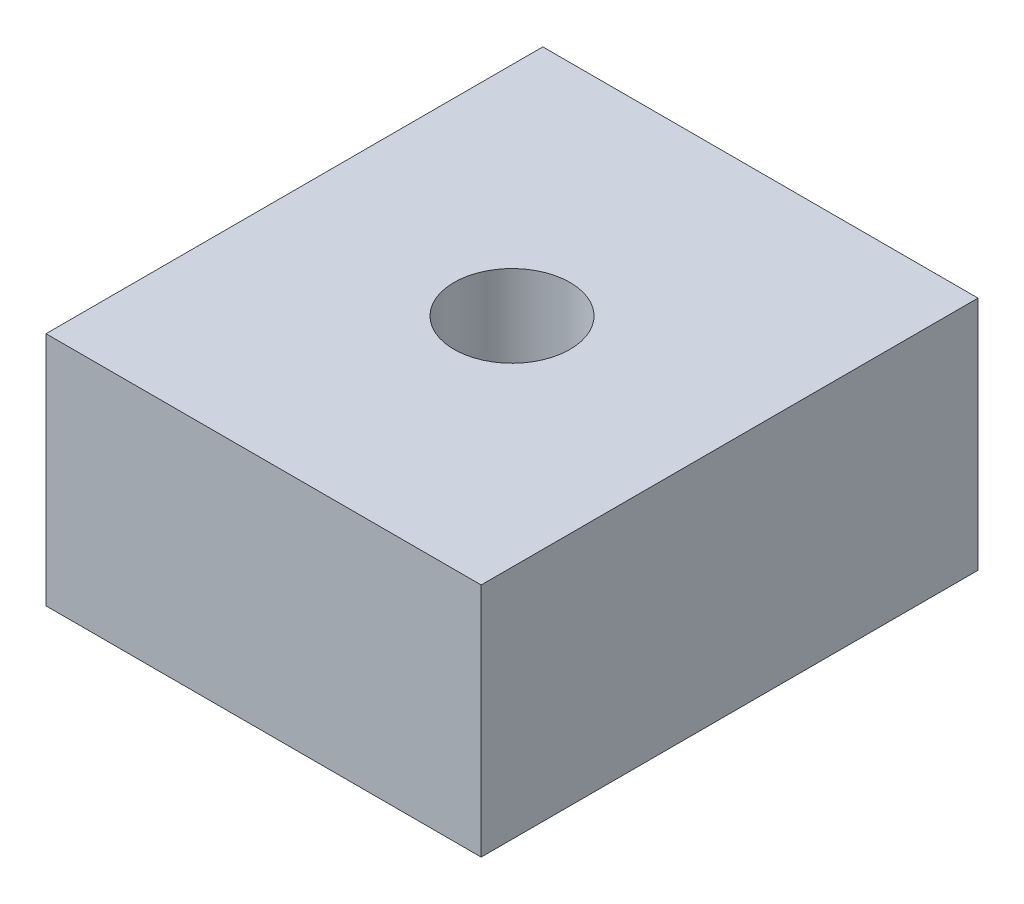
ISO-10303-21;
HEADER;
FILE_DESCRIPTION(('STEP AP214'),'2;1');
FILE_NAME('part.step','',(''),(''),'','','');
FILE_SCHEMA(('AUTOMOTIVE_DESIGN { 1 0 10303 214 1 1 1 1 }'));
ENDSEC;
DATA;
#1=APPLICATION_CONTEXT('core data for automotive mechanical design processes');
#2=APPLICATION_PROTOCOL_DEFINITION('international standard','automotive_design',2000,#1);
#3=PRODUCT_CONTEXT('',#1,'mechanical');
#4=PRODUCT('Part','Part','',(#3));
#5=PRODUCT_RELATED_PRODUCT_CATEGORY('part','',(#4));
#6=PRODUCT_DEFINITION_FORMATION('','',#4);
#7=PRODUCT_DEFINITION_CONTEXT('part definition',#1,'design');
#8=PRODUCT_DEFINITION('design','',#6,#7);
#9=PRODUCT_DEFINITION_SHAPE('','',#8);
#10=(LENGTH_UNIT() NAMED_UNIT(*) SI_UNIT(.MILLI.,.METRE.));
#11=(NAMED_UNIT(*) PLANE_ANGLE_UNIT() SI_UNIT($,.RADIAN.));
#12=(NAMED_UNIT(*) SI_UNIT($,.STERADIAN.) SOLID_ANGLE_UNIT());
#13=UNCERTAINTY_MEASURE_WITH_UNIT(LENGTH_MEASURE(1.E-05),#10,'distance_accuracy_value','');
#14=(GEOMETRIC_REPRESENTATION_CONTEXT(3) GLOBAL_UNCERTAINTY_ASSIGNED_CONTEXT((#13)) GLOBAL_UNIT_ASSIGNED_CONTEXT((#10,
#11,#12)) REPRESENTATION_CONTEXT('',''));
#15=CARTESIAN_POINT('',(0.,0.,0.));
#16=DIRECTION('',(0.,0.,1.));
#17=DIRECTION('',(1.,0.,0.));
#18=AXIS2_PLACEMENT_3D('',#15,#16,#17);
#19=CARTESIAN_POINT('',(-6.,6.5,6.85));
#20=DIRECTION('',(1.,0.,0.));
#21=DIRECTION('',(0.,0.,-1.));
#22=AXIS2_PLACEMENT_3D('',#19,#20,#21);
#23=PLANE('',#22);
#24=DIRECTION('',(0.,0.,1.));
#25=VECTOR('',#24,1.);
#26=CARTESIAN_POINT('',(-6.,0.,6.85));
#27=LINE('',#26,#25);
#28=CARTESIAN_POINT('',(-6.,0.,-6.85));
#29=VERTEX_POINT('',#28);
#30=CARTESIAN_POINT('',(-6.,0.,6.85));
#31=VERTEX_POINT('',#30);
#32=EDGE_CURVE('E168',#29,#31,#27,.T.);
#33=ORIENTED_EDGE('',*,*,#32,.T.);
#34=DIRECTION('',(0.,-1.,0.));
#35=VECTOR('',#34,1.);
#36=CARTESIAN_POINT('',(-6.,6.5,6.85));
#37=LINE('',#36,#35);
#38=CARTESIAN_POINT('',(-6.,6.5,6.85));
#39=VERTEX_POINT('',#38);
#40=EDGE_CURVE('E11',#39,#31,#37,.T.);
#41=ORIENTED_EDGE('',*,*,#40,.F.);
#42=DIRECTION('',(0.,0.,1.));
#43=VECTOR('',#42,1.);
#44=CARTESIAN_POINT('',(-6.,6.5,6.85));
#45=LINE('',#44,#43);
#46=CARTESIAN_POINT('',(-6.,6.5,-6.85));
#47=VERTEX_POINT('',#46);
#48=EDGE_CURVE('E176',#47,#39,#45,.T.);
#49=ORIENTED_EDGE('',*,*,#48,.F.);
#50=DIRECTION('',(0.,-1.,0.));
#51=VECTOR('',#50,1.);
#52=CARTESIAN_POINT('',(-6.,6.5,-6.85));
#53=LINE('',#52,#51);
#54=EDGE_CURVE('E182',#47,#29,#53,.T.);
#55=ORIENTED_EDGE('',*,*,#54,.T.);
#56=EDGE_LOOP('',(#33,#41,#49,#55));
#57=FACE_BOUND('',#56,.T.);
#58=ADVANCED_FACE('F33',(#57),#23,.F.);
#59=CARTESIAN_POINT('',(-6.,6.5,6.85));
#60=DIRECTION('',(0.,0.,-1.));
#61=DIRECTION('',(-1.,0.,0.));
#62=AXIS2_PLACEMENT_3D('',#59,#60,#61);
#63=PLANE('',#62);
#64=DIRECTION('',(1.,0.,0.));
#65=VECTOR('',#64,1.);
#66=CARTESIAN_POINT('',(-6.,0.,6.85));
#67=LINE('',#66,#65);
#68=CARTESIAN_POINT('',(6.,0.,6.85));
#69=VERTEX_POINT('',#68);
#70=EDGE_CURVE('E185',#31,#69,#67,.T.);
#71=ORIENTED_EDGE('',*,*,#70,.T.);
#72=DIRECTION('',(0.,-1.,0.));
#73=VECTOR('',#72,1.);
#74=CARTESIAN_POINT('',(6.,6.5,6.85));
#75=LINE('',#74,#73);
#76=CARTESIAN_POINT('',(6.,6.5,6.85));
#77=VERTEX_POINT('',#76);
#78=EDGE_CURVE('E41',#77,#69,#75,.T.);
#79=ORIENTED_EDGE('',*,*,#78,.F.);
#80=DIRECTION('',(1.,0.,0.));
#81=VECTOR('',#80,1.);
#82=CARTESIAN_POINT('',(-6.,6.5,6.85));
#83=LINE('',#82,#81);
#84=EDGE_CURVE('E85',#39,#77,#83,.T.);
#85=ORIENTED_EDGE('',*,*,#84,.F.);
#86=ORIENTED_EDGE('',*,*,#40,.T.);
#87=EDGE_LOOP('',(#71,#79,#85,#86));
#88=FACE_BOUND('',#87,.T.);
#89=ADVANCED_FACE('F216',(#88),#63,.F.);
#90=CARTESIAN_POINT('',(6.,6.5,6.85));
#91=DIRECTION('',(-1.,0.,0.));
#92=DIRECTION('',(0.,0.,1.));
#93=AXIS2_PLACEMENT_3D('',#90,#91,#92);
#94=PLANE('',#93);
#95=DIRECTION('',(0.,0.,-1.));
#96=VECTOR('',#95,1.);
#97=CARTESIAN_POINT('',(6.,0.,6.85));
#98=LINE('',#97,#96);
#99=CARTESIAN_POINT('',(6.,0.,-6.85));
#100=VERTEX_POINT('',#99);
#101=EDGE_CURVE('E187',#69,#100,#98,.T.);
#102=ORIENTED_EDGE('',*,*,#101,.T.);
#103=DIRECTION('',(0.,-1.,0.));
#104=VECTOR('',#103,1.);
#105=CARTESIAN_POINT('',(6.,6.5,-6.85));
#106=LINE('',#105,#104);
#107=CARTESIAN_POINT('',(6.,6.5,-6.85));
#108=VERTEX_POINT('',#107);
#109=EDGE_CURVE('E191',#108,#100,#106,.T.);
#110=ORIENTED_EDGE('',*,*,#109,.F.);
#111=DIRECTION('',(0.,0.,-1.));
#112=VECTOR('',#111,1.);
#113=CARTESIAN_POINT('',(6.,6.5,6.85));
#114=LINE('',#113,#112);
#115=EDGE_CURVE('E179',#77,#108,#114,.T.);
#116=ORIENTED_EDGE('',*,*,#115,.F.);
#117=ORIENTED_EDGE('',*,*,#78,.T.);
#118=EDGE_LOOP('',(#102,#110,#116,#117));
#119=FACE_BOUND('',#118,.T.);
#120=ADVANCED_FACE('F197',(#119),#94,.F.);
#121=CARTESIAN_POINT('',(-6.,6.5,-6.85));
#122=DIRECTION('',(0.,0.,1.));
#123=DIRECTION('',(1.,0.,0.));
#124=AXIS2_PLACEMENT_3D('',#121,#122,#123);
#125=PLANE('',#124);
#126=DIRECTION('',(-1.,0.,0.));
#127=VECTOR('',#126,1.);
#128=CARTESIAN_POINT('',(-6.,0.,-6.85));
#129=LINE('',#128,#127);
#130=EDGE_CURVE('E78',#100,#29,#129,.T.);
#131=ORIENTED_EDGE('',*,*,#130,.T.);
#132=ORIENTED_EDGE('',*,*,#54,.F.);
#133=DIRECTION('',(-1.,0.,0.));
#134=VECTOR('',#133,1.);
#135=CARTESIAN_POINT('',(-6.,6.5,-6.85));
#136=LINE('',#135,#134);
#137=EDGE_CURVE('E57',#108,#47,#136,.T.);
#138=ORIENTED_EDGE('',*,*,#137,.F.);
#139=ORIENTED_EDGE('',*,*,#109,.T.);
#140=EDGE_LOOP('',(#131,#132,#138,#139));
#141=FACE_BOUND('',#140,.T.);
#142=ADVANCED_FACE('F205',(#141),#125,.F.);
#143=CARTESIAN_POINT('',(0.,6.5,0.));
#144=DIRECTION('',(0.,-1.,0.));
#145=DIRECTION('',(0.,0.,-1.));
#146=AXIS2_PLACEMENT_3D('',#143,#144,#145);
#147=PLANE('',#146);
#148=CARTESIAN_POINT('',(0.,6.5,0.));
#149=DIRECTION('',(0.,-1.,0.));
#150=DIRECTION('',(0.,0.,-1.));
#151=AXIS2_PLACEMENT_3D('',#148,#149,#150);
#152=CIRCLE('',#151,1.6);
#153=CARTESIAN_POINT('',(0.,6.5,-1.6));
#154=VERTEX_POINT('',#153);
#155=EDGE_CURVE('E146',#154,#154,#152,.T.);
#156=ORIENTED_EDGE('',*,*,#155,.T.);
#157=EDGE_LOOP('',(#156));
#158=FACE_BOUND('',#157,.T.);
#159=ORIENTED_EDGE('',*,*,#48,.T.);
#160=ORIENTED_EDGE('',*,*,#84,.T.);
#161=ORIENTED_EDGE('',*,*,#115,.T.);
#162=ORIENTED_EDGE('',*,*,#137,.T.);
#163=EDGE_LOOP('',(#159,#160,#161,#162));
#164=FACE_BOUND('',#163,.T.);
#165=ADVANCED_FACE('F207',(#158,#164),#147,.F.);
#166=CARTESIAN_POINT('',(0.,0.,0.));
#167=DIRECTION('',(0.,-1.,0.));
#168=DIRECTION('',(0.,0.,-1.));
#169=AXIS2_PLACEMENT_3D('',#166,#167,#168);
#170=PLANE('',#169);
#171=DIRECTION('',(0.489324181913888,0.,-0.872101969378756));
#172=VECTOR('',#171,1.);
#173=CARTESIAN_POINT('',(-3.34837891083042,0.,0.0411339621164434));
#174=LINE('',#173,#172);
#175=CARTESIAN_POINT('',(-3.34837891083042,0.,0.0411339621164434));
#176=VERTEX_POINT('',#175);
#177=CARTESIAN_POINT('',(-1.70981251156636,0.,-2.87921421721699));
#178=VERTEX_POINT('',#177);
#179=EDGE_CURVE('E48',#176,#178,#174,.T.);
#180=ORIENTED_EDGE('',*,*,#179,.F.);
#181=DIRECTION('',(-0.510600369215497,0.,-0.859818156912843));
#182=VECTOR('',#181,1.);
#183=CARTESIAN_POINT('',(-1.63856639926407,0.,2.92034817933344));
#184=LINE('',#183,#182);
#185=CARTESIAN_POINT('',(-1.63856639926407,0.,2.92034817933344));
#186=VERTEX_POINT('',#185);
#187=EDGE_CURVE('E140',#186,#176,#184,.T.);
#188=ORIENTED_EDGE('',*,*,#187,.F.);
#189=DIRECTION('',(-0.999924551129385,0.,0.0122838124659128));
#190=VECTOR('',#189,1.);
#191=CARTESIAN_POINT('',(1.70981251156636,0.,2.87921421721699));
#192=LINE('',#191,#190);
#193=CARTESIAN_POINT('',(1.70981251156636,0.,2.87921421721699));
#194=VERTEX_POINT('',#193);
#195=EDGE_CURVE('E143',#194,#186,#192,.T.);
#196=ORIENTED_EDGE('',*,*,#195,.F.);
#197=DIRECTION('',(-0.489324181913888,0.,0.872101969378756));
#198=VECTOR('',#197,1.);
#199=CARTESIAN_POINT('',(3.34837891083042,0.,-0.0411339621164444));
#200=LINE('',#199,#198);
#201=CARTESIAN_POINT('',(3.34837891083042,0.,-0.0411339621164444));
#202=VERTEX_POINT('',#201);
#203=EDGE_CURVE('E161',#202,#194,#200,.T.);
#204=ORIENTED_EDGE('',*,*,#203,.F.);
#205=DIRECTION('',(0.510600369215497,0.,0.859818156912843));
#206=VECTOR('',#205,1.);
#207=CARTESIAN_POINT('',(1.63856639926406,0.,-2.92034817933344));
#208=LINE('',#207,#206);
#209=CARTESIAN_POINT('',(1.63856639926406,0.,-2.92034817933344));
#210=VERTEX_POINT('',#209);
#211=EDGE_CURVE('E158',#210,#202,#208,.T.);
#212=ORIENTED_EDGE('',*,*,#211,.F.);
#213=DIRECTION('',(0.999924551129385,0.,-0.0122838124659129));
#214=VECTOR('',#213,1.);
#215=CARTESIAN_POINT('',(-1.70981251156636,0.,-2.87921421721699));
#216=LINE('',#215,#214);
#217=EDGE_CURVE('E156',#178,#210,#216,.T.);
#218=ORIENTED_EDGE('',*,*,#217,.F.);
#219=EDGE_LOOP('',(#180,#188,#196,#204,#212,#218));
#220=FACE_BOUND('',#219,.T.);
#221=ORIENTED_EDGE('',*,*,#32,.F.);
#222=ORIENTED_EDGE('',*,*,#130,.F.);
#223=ORIENTED_EDGE('',*,*,#101,.F.);
#224=ORIENTED_EDGE('',*,*,#70,.F.);
#225=EDGE_LOOP('',(#221,#222,#223,#224));
#226=FACE_BOUND('',#225,.T.);
#227=ADVANCED_FACE('F201',(#220,#226),#170,.T.);
#228=CARTESIAN_POINT('',(-3.34837891083042,3.,0.0411339621164434));
#229=DIRECTION('',(-0.872101969378755,0.,-0.489324181913888));
#230=DIRECTION('',(-0.489324181913888,0.,0.872101969378756));
#231=AXIS2_PLACEMENT_3D('',#228,#229,#230);
#232=PLANE('',#231);
#233=ORIENTED_EDGE('',*,*,#179,.T.);
#234=DIRECTION('',(0.,-1.,0.));
#235=VECTOR('',#234,1.);
#236=CARTESIAN_POINT('',(-1.70981251156636,3.,-2.87921421721699));
#237=LINE('',#236,#235);
#238=CARTESIAN_POINT('',(-1.70981251156636,3.,-2.87921421721699));
#239=VERTEX_POINT('',#238);
#240=EDGE_CURVE('E117',#239,#178,#237,.T.);
#241=ORIENTED_EDGE('',*,*,#240,.F.);
#242=DIRECTION('',(0.489324181913888,0.,-0.872101969378756));
#243=VECTOR('',#242,1.);
#244=CARTESIAN_POINT('',(-3.34837891083042,3.,0.0411339621164434));
#245=LINE('',#244,#243);
#246=CARTESIAN_POINT('',(-3.34837891083042,3.,0.0411339621164434));
#247=VERTEX_POINT('',#246);
#248=EDGE_CURVE('E121',#247,#239,#245,.T.);
#249=ORIENTED_EDGE('',*,*,#248,.F.);
#250=DIRECTION('',(0.,-1.,0.));
#251=VECTOR('',#250,1.);
#252=CARTESIAN_POINT('',(-3.34837891083042,3.,0.0411339621164434));
#253=LINE('',#252,#251);
#254=EDGE_CURVE('E166',#247,#176,#253,.T.);
#255=ORIENTED_EDGE('',*,*,#254,.T.);
#256=EDGE_LOOP('',(#233,#241,#249,#255));
#257=FACE_BOUND('',#256,.T.);
#258=ADVANCED_FACE('F119',(#257),#232,.F.);
#259=CARTESIAN_POINT('',(-1.63856639926407,3.,2.92034817933344));
#260=DIRECTION('',(-0.859818156912843,0.,0.510600369215497));
#261=DIRECTION('',(0.510600369215497,0.,0.859818156912843));
#262=AXIS2_PLACEMENT_3D('',#259,#260,#261);
#263=PLANE('',#262);
#264=ORIENTED_EDGE('',*,*,#187,.T.);
#265=ORIENTED_EDGE('',*,*,#254,.F.);
#266=DIRECTION('',(-0.510600369215497,0.,-0.859818156912843));
#267=VECTOR('',#266,1.);
#268=CARTESIAN_POINT('',(-1.63856639926407,3.,2.92034817933344));
#269=LINE('',#268,#267);
#270=CARTESIAN_POINT('',(-1.63856639926407,3.,2.92034817933344));
#271=VERTEX_POINT('',#270);
#272=EDGE_CURVE('E127',#271,#247,#269,.T.);
#273=ORIENTED_EDGE('',*,*,#272,.F.);
#274=DIRECTION('',(0.,-1.,0.));
#275=VECTOR('',#274,1.);
#276=CARTESIAN_POINT('',(-1.63856639926407,3.,2.92034817933344));
#277=LINE('',#276,#275);
#278=EDGE_CURVE('E169',#271,#186,#277,.T.);
#279=ORIENTED_EDGE('',*,*,#278,.T.);
#280=EDGE_LOOP('',(#264,#265,#273,#279));
#281=FACE_BOUND('',#280,.T.);
#282=ADVANCED_FACE('F251',(#281),#263,.F.);
#283=CARTESIAN_POINT('',(1.70981251156636,3.,2.87921421721699));
#284=DIRECTION('',(0.0122838124659128,0.,0.999924551129385));
#285=DIRECTION('',(0.999924551129385,0.,-0.0122838124659128));
#286=AXIS2_PLACEMENT_3D('',#283,#284,#285);
#287=PLANE('',#286);
#288=ORIENTED_EDGE('',*,*,#195,.T.);
#289=ORIENTED_EDGE('',*,*,#278,.F.);
#290=DIRECTION('',(-0.999924551129385,0.,0.0122838124659128));
#291=VECTOR('',#290,1.);
#292=CARTESIAN_POINT('',(1.70981251156636,3.,2.87921421721699));
#293=LINE('',#292,#291);
#294=CARTESIAN_POINT('',(1.70981251156636,3.,2.87921421721699));
#295=VERTEX_POINT('',#294);
#296=EDGE_CURVE('E152',#295,#271,#293,.T.);
#297=ORIENTED_EDGE('',*,*,#296,.F.);
#298=DIRECTION('',(0.,-1.,0.));
#299=VECTOR('',#298,1.);
#300=CARTESIAN_POINT('',(1.70981251156636,3.,2.87921421721699));
#301=LINE('',#300,#299);
#302=EDGE_CURVE('E171',#295,#194,#301,.T.);
#303=ORIENTED_EDGE('',*,*,#302,.T.);
#304=EDGE_LOOP('',(#288,#289,#297,#303));
#305=FACE_BOUND('',#304,.T.);
#306=ADVANCED_FACE('F260',(#305),#287,.F.);
#307=CARTESIAN_POINT('',(3.34837891083042,3.,-0.0411339621164444));
#308=DIRECTION('',(0.872101969378755,0.,0.489324181913888));
#309=DIRECTION('',(0.489324181913888,0.,-0.872101969378756));
#310=AXIS2_PLACEMENT_3D('',#307,#308,#309);
#311=PLANE('',#310);
#312=ORIENTED_EDGE('',*,*,#203,.T.);
#313=ORIENTED_EDGE('',*,*,#302,.F.);
#314=DIRECTION('',(-0.489324181913888,0.,0.872101969378756));
#315=VECTOR('',#314,1.);
#316=CARTESIAN_POINT('',(3.34837891083042,3.,-0.0411339621164444));
#317=LINE('',#316,#315);
#318=CARTESIAN_POINT('',(3.34837891083042,3.,-0.0411339621164444));
#319=VERTEX_POINT('',#318);
#320=EDGE_CURVE('E149',#319,#295,#317,.T.);
#321=ORIENTED_EDGE('',*,*,#320,.F.);
#322=DIRECTION('',(0.,-1.,0.));
#323=VECTOR('',#322,1.);
#324=CARTESIAN_POINT('',(3.34837891083042,3.,-0.0411339621164444));
#325=LINE('',#324,#323);
#326=EDGE_CURVE('E173',#319,#202,#325,.T.);
#327=ORIENTED_EDGE('',*,*,#326,.T.);
#328=EDGE_LOOP('',(#312,#313,#321,#327));
#329=FACE_BOUND('',#328,.T.);
#330=ADVANCED_FACE('F270',(#329),#311,.F.);
#331=CARTESIAN_POINT('',(1.63856639926406,3.,-2.92034817933344));
#332=DIRECTION('',(0.859818156912843,0.,-0.510600369215497));
#333=DIRECTION('',(-0.510600369215497,0.,-0.859818156912843));
#334=AXIS2_PLACEMENT_3D('',#331,#332,#333);
#335=PLANE('',#334);
#336=ORIENTED_EDGE('',*,*,#211,.T.);
#337=ORIENTED_EDGE('',*,*,#326,.F.);
#338=DIRECTION('',(0.510600369215497,0.,0.859818156912843));
#339=VECTOR('',#338,1.);
#340=CARTESIAN_POINT('',(1.63856639926406,3.,-2.92034817933344));
#341=LINE('',#340,#339);
#342=CARTESIAN_POINT('',(1.63856639926406,3.,-2.92034817933344));
#343=VERTEX_POINT('',#342);
#344=EDGE_CURVE('E135',#343,#319,#341,.T.);
#345=ORIENTED_EDGE('',*,*,#344,.F.);
#346=DIRECTION('',(0.,-1.,0.));
#347=VECTOR('',#346,1.);
#348=CARTESIAN_POINT('',(1.63856639926406,3.,-2.92034817933344));
#349=LINE('',#348,#347);
#350=EDGE_CURVE('E126',#343,#210,#349,.T.);
#351=ORIENTED_EDGE('',*,*,#350,.T.);
#352=EDGE_LOOP('',(#336,#337,#345,#351));
#353=FACE_BOUND('',#352,.T.);
#354=ADVANCED_FACE('F280',(#353),#335,.F.);
#355=CARTESIAN_POINT('',(-1.70981251156636,3.,-2.87921421721699));
#356=DIRECTION('',(-0.0122838124659129,0.,-0.999924551129385));
#357=DIRECTION('',(-0.999924551129385,0.,0.0122838124659129));
#358=AXIS2_PLACEMENT_3D('',#355,#356,#357);
#359=PLANE('',#358);
#360=ORIENTED_EDGE('',*,*,#217,.T.);
#361=ORIENTED_EDGE('',*,*,#350,.F.);
#362=DIRECTION('',(0.999924551129385,0.,-0.0122838124659129));
#363=VECTOR('',#362,1.);
#364=CARTESIAN_POINT('',(-1.70981251156636,3.,-2.87921421721699));
#365=LINE('',#364,#363);
#366=EDGE_CURVE('E130',#239,#343,#365,.T.);
#367=ORIENTED_EDGE('',*,*,#366,.F.);
#368=ORIENTED_EDGE('',*,*,#240,.T.);
#369=EDGE_LOOP('',(#360,#361,#367,#368));
#370=FACE_BOUND('',#369,.T.);
#371=ADVANCED_FACE('F131',(#370),#359,.F.);
#372=CARTESIAN_POINT('',(0.,3.,0.));
#373=DIRECTION('',(0.,-1.,0.));
#374=DIRECTION('',(0.,0.,-1.));
#375=AXIS2_PLACEMENT_3D('',#372,#373,#374);
#376=PLANE('',#375);
#377=CARTESIAN_POINT('',(0.,3.,0.));
#378=DIRECTION('',(0.,-1.,0.));
#379=DIRECTION('',(0.,0.,-1.));
#380=AXIS2_PLACEMENT_3D('',#377,#378,#379);
#381=CIRCLE('',#380,1.6);
#382=CARTESIAN_POINT('',(0.,3.,-1.6));
#383=VERTEX_POINT('',#382);
#384=EDGE_CURVE('E36',#383,#383,#381,.T.);
#385=ORIENTED_EDGE('',*,*,#384,.F.);
#386=EDGE_LOOP('',(#385));
#387=FACE_BOUND('',#386,.T.);
#388=ORIENTED_EDGE('',*,*,#248,.T.);
#389=ORIENTED_EDGE('',*,*,#366,.T.);
#390=ORIENTED_EDGE('',*,*,#344,.T.);
#391=ORIENTED_EDGE('',*,*,#320,.T.);
#392=ORIENTED_EDGE('',*,*,#296,.T.);
#393=ORIENTED_EDGE('',*,*,#272,.T.);
#394=EDGE_LOOP('',(#388,#389,#390,#391,#392,#393));
#395=FACE_BOUND('',#394,.T.);
#396=ADVANCED_FACE('F137',(#387,#395),#376,.T.);
#397=CARTESIAN_POINT('',(0.,6.5,0.));
#398=DIRECTION('',(0.,-1.,0.));
#399=DIRECTION('',(0.,0.,-1.));
#400=AXIS2_PLACEMENT_3D('',#397,#398,#399);
#401=CYLINDRICAL_SURFACE('',#400,1.6);
#402=CARTESIAN_POINT('',(0.,3.,-1.6));
#403=CARTESIAN_POINT('',(0.,3.03645833333333,-1.6));
#404=CARTESIAN_POINT('',(0.,3.07291666666667,-1.6));
#405=CARTESIAN_POINT('',(0.,3.14583333333333,-1.6));
#406=CARTESIAN_POINT('',(0.,3.18229166666667,-1.6));
#407=CARTESIAN_POINT('',(0.,3.25520833333333,-1.6));
#408=CARTESIAN_POINT('',(0.,3.29166666666667,-1.6));
#409=CARTESIAN_POINT('',(0.,3.36458333333333,-1.6));
#410=CARTESIAN_POINT('',(0.,3.40104166666667,-1.6));
#411=CARTESIAN_POINT('',(0.,3.47395833333333,-1.6));
#412=CARTESIAN_POINT('',(0.,3.51041666666667,-1.6));
#413=CARTESIAN_POINT('',(0.,3.58333333333333,-1.6));
#414=CARTESIAN_POINT('',(0.,3.61979166666667,-1.6));
#415=CARTESIAN_POINT('',(0.,3.69270833333333,-1.6));
#416=CARTESIAN_POINT('',(0.,3.72916666666667,-1.6));
#417=CARTESIAN_POINT('',(0.,3.80208333333333,-1.6));
#418=CARTESIAN_POINT('',(0.,3.83854166666667,-1.6));
#419=CARTESIAN_POINT('',(0.,3.91145833333333,-1.6));
#420=CARTESIAN_POINT('',(0.,3.94791666666667,-1.6));
#421=CARTESIAN_POINT('',(0.,4.02083333333333,-1.6));
#422=CARTESIAN_POINT('',(0.,4.05729166666667,-1.6));
#423=CARTESIAN_POINT('',(0.,4.13020833333333,-1.6));
#424=CARTESIAN_POINT('',(0.,4.16666666666667,-1.6));
#425=CARTESIAN_POINT('',(0.,4.23958333333333,-1.6));
#426=CARTESIAN_POINT('',(0.,4.27604166666667,-1.6));
#427=CARTESIAN_POINT('',(0.,4.34895833333333,-1.6));
#428=CARTESIAN_POINT('',(0.,4.38541666666667,-1.6));
#429=CARTESIAN_POINT('',(0.,4.45833333333333,-1.6));
#430=CARTESIAN_POINT('',(0.,4.49479166666667,-1.6));
#431=CARTESIAN_POINT('',(0.,4.56770833333333,-1.6));
#432=CARTESIAN_POINT('',(0.,4.60416666666667,-1.6));
#433=CARTESIAN_POINT('',(0.,4.67708333333333,-1.6));
#434=CARTESIAN_POINT('',(0.,4.71354166666667,-1.6));
#435=CARTESIAN_POINT('',(0.,4.78645833333333,-1.6));
#436=CARTESIAN_POINT('',(0.,4.82291666666667,-1.6));
#437=CARTESIAN_POINT('',(0.,4.89583333333333,-1.6));
#438=CARTESIAN_POINT('',(0.,4.93229166666667,-1.6));
#439=CARTESIAN_POINT('',(0.,5.00520833333333,-1.6));
#440=CARTESIAN_POINT('',(0.,5.04166666666667,-1.6));
#441=CARTESIAN_POINT('',(0.,5.11458333333333,-1.6));
#442=CARTESIAN_POINT('',(0.,5.15104166666667,-1.6));
#443=CARTESIAN_POINT('',(0.,5.22395833333333,-1.6));
#444=CARTESIAN_POINT('',(0.,5.26041666666667,-1.6));
#445=CARTESIAN_POINT('',(0.,5.33333333333333,-1.6));
#446=CARTESIAN_POINT('',(0.,5.36979166666667,-1.6));
#447=CARTESIAN_POINT('',(0.,5.44270833333333,-1.6));
#448=CARTESIAN_POINT('',(0.,5.47916666666667,-1.6));
#449=CARTESIAN_POINT('',(0.,5.55208333333333,-1.6));
#450=CARTESIAN_POINT('',(0.,5.58854166666667,-1.6));
#451=CARTESIAN_POINT('',(0.,5.66145833333333,-1.6));
#452=CARTESIAN_POINT('',(0.,5.69791666666667,-1.6));
#453=CARTESIAN_POINT('',(0.,5.77083333333333,-1.6));
#454=CARTESIAN_POINT('',(0.,5.80729166666667,-1.6));
#455=CARTESIAN_POINT('',(0.,5.88020833333333,-1.6));
#456=CARTESIAN_POINT('',(0.,5.91666666666667,-1.6));
#457=CARTESIAN_POINT('',(0.,5.98958333333333,-1.6));
#458=CARTESIAN_POINT('',(0.,6.02604166666667,-1.6));
#459=CARTESIAN_POINT('',(0.,6.09895833333333,-1.6));
#460=CARTESIAN_POINT('',(0.,6.13541666666667,-1.6));
#461=CARTESIAN_POINT('',(0.,6.20833333333333,-1.6));
#462=CARTESIAN_POINT('',(0.,6.24479166666667,-1.6));
#463=CARTESIAN_POINT('',(0.,6.31770833333333,-1.6));
#464=CARTESIAN_POINT('',(0.,6.35416666666667,-1.6));
#465=CARTESIAN_POINT('',(0.,6.42708333333333,-1.6));
#466=CARTESIAN_POINT('',(0.,6.46354166666667,-1.6));
#467=CARTESIAN_POINT('',(0.,6.5,-1.6));
#468=B_SPLINE_CURVE_WITH_KNOTS('',3,(#402,#403,#404,#405,#406,#407,#408,#409,#410,#411,#412,
#413,#414,#415,#416,#417,#418,#419,#420,#421,#422,#423,#424,#425,#426,#427,#428,#429,#430,#431,
#432,#433,#434,#435,#436,#437,#438,#439,#440,#441,#442,#443,#444,#445,#446,#447,#448,#449,#450,
#451,#452,#453,#454,#455,#456,#457,#458,#459,#460,#461,#462,#463,#464,#465,#466,#467),
.UNSPECIFIED.,.F.,.F.,(4,2,2,2,2,2,2,2,2,2,2,2,2,2,2,2,2,2,2,2,2,2,2,2,2,2,2,2,2,2,2,2,4),(0.,
0.109375,0.21875,0.328125,0.4375,0.546875,0.65625,0.765625,0.875,0.984375,1.09375,1.203125,
1.3125,1.421875,1.53125,1.640625,1.75,1.859375,1.96875,2.078125,2.1875,2.296875,2.40625,
2.515625,2.625,2.734375,2.84375,2.953125,3.0625,3.171875,3.28125,3.390625,3.5),.UNSPECIFIED.);
#469=EDGE_CURVE('BSEAM309',#383,#154,#468,.T.);
#470=ORIENTED_EDGE('',*,*,#384,.T.);
#471=ORIENTED_EDGE('',*,*,#155,.F.);
#472=ORIENTED_EDGE('',*,*,#469,.T.);
#473=ORIENTED_EDGE('',*,*,#469,.F.);
#474=EDGE_LOOP('',(#470,#472,#471,#473));
#475=FACE_BOUND('',#474,.T.);
#476=ADVANCED_FACE('F309',(#475),#401,.F.);
#477=CLOSED_SHELL('',(#58,#89,#120,#142,#165,#227,#258,#282,#306,#330,#354,#371,#396,#476));
#478=MANIFOLD_SOLID_BREP('B2',#477);
#479=ADVANCED_BREP_SHAPE_REPRESENTATION('',(#18,#478),#14);
#480=SHAPE_DEFINITION_REPRESENTATION(#9,#479);
ENDSEC;
END-ISO-10303-21;
